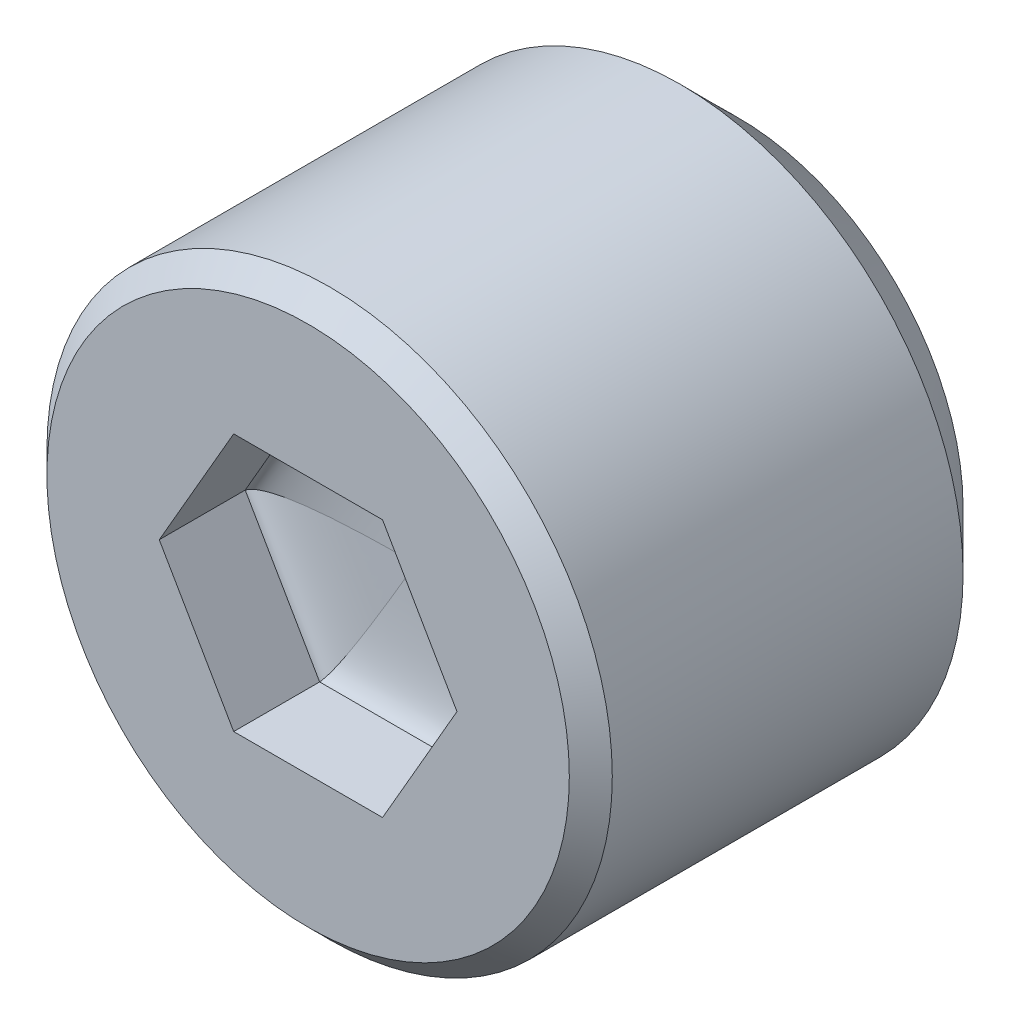
ISO-10303-21;
HEADER;
FILE_DESCRIPTION(('STEP AP214'),'2;1');
FILE_NAME('part.step','',(''),(''),'','','');
FILE_SCHEMA(('AUTOMOTIVE_DESIGN { 1 0 10303 214 1 1 1 1 }'));
ENDSEC;
DATA;
#1=APPLICATION_CONTEXT('core data for automotive mechanical design processes');
#2=APPLICATION_PROTOCOL_DEFINITION('international standard','automotive_design',2000,#1);
#3=PRODUCT_CONTEXT('',#1,'mechanical');
#4=PRODUCT('Part','Part','',(#3));
#5=PRODUCT_RELATED_PRODUCT_CATEGORY('part','',(#4));
#6=PRODUCT_DEFINITION_FORMATION('','',#4);
#7=PRODUCT_DEFINITION_CONTEXT('part definition',#1,'design');
#8=PRODUCT_DEFINITION('design','',#6,#7);
#9=PRODUCT_DEFINITION_SHAPE('','',#8);
#10=(LENGTH_UNIT() NAMED_UNIT(*) SI_UNIT(.MILLI.,.METRE.));
#11=(NAMED_UNIT(*) PLANE_ANGLE_UNIT() SI_UNIT($,.RADIAN.));
#12=(NAMED_UNIT(*) SI_UNIT($,.STERADIAN.) SOLID_ANGLE_UNIT());
#13=UNCERTAINTY_MEASURE_WITH_UNIT(LENGTH_MEASURE(1.E-05),#10,'distance_accuracy_value','');
#14=(GEOMETRIC_REPRESENTATION_CONTEXT(3) GLOBAL_UNCERTAINTY_ASSIGNED_CONTEXT((#13)) GLOBAL_UNIT_ASSIGNED_CONTEXT((#10,
#11,#12)) REPRESENTATION_CONTEXT('',''));
#15=CARTESIAN_POINT('',(0.,0.,0.));
#16=DIRECTION('',(0.,0.,1.));
#17=DIRECTION('',(1.,0.,0.));
#18=AXIS2_PLACEMENT_3D('',#15,#16,#17);
#19=CARTESIAN_POINT('',(0.,0.,5.));
#20=DIRECTION('',(0.,0.,-1.));
#21=DIRECTION('',(-1.,0.,0.));
#22=AXIS2_PLACEMENT_3D('',#19,#20,#21);
#23=CYLINDRICAL_SURFACE('',#22,6.5785);
#24=CARTESIAN_POINT('',(0.,0.,4.5));
#25=DIRECTION('',(0.,0.,1.));
#26=DIRECTION('',(1.,0.,0.));
#27=AXIS2_PLACEMENT_3D('',#24,#25,#26);
#28=CIRCLE('',#27,6.5785);
#29=CARTESIAN_POINT('',(6.5785,0.,4.5));
#30=VERTEX_POINT('',#29);
#31=EDGE_CURVE('E11',#30,#30,#28,.F.);
#32=ORIENTED_EDGE('',*,*,#31,.T.);
#33=EDGE_LOOP('',(#32));
#34=FACE_BOUND('',#33,.T.);
#35=CARTESIAN_POINT('',(0.,0.,-3.66299999999998));
#36=DIRECTION('',(0.,0.,1.));
#37=DIRECTION('',(1.,0.,0.));
#38=AXIS2_PLACEMENT_3D('',#35,#36,#37);
#39=CIRCLE('',#38,6.5785);
#40=CARTESIAN_POINT('',(6.5785,0.,-3.66299999999998));
#41=VERTEX_POINT('',#40);
#42=EDGE_CURVE('E118',#41,#41,#39,.T.);
#43=ORIENTED_EDGE('',*,*,#42,.T.);
#44=EDGE_LOOP('',(#43));
#45=FACE_BOUND('',#44,.T.);
#46=ADVANCED_FACE('F43',(#34,#45),#23,.T.);
#47=CARTESIAN_POINT('',(0.,0.,5.));
#48=DIRECTION('',(0.,0.,1.));
#49=DIRECTION('',(1.,0.,0.));
#50=AXIS2_PLACEMENT_3D('',#47,#48,#49);
#51=PLANE('',#50);
#52=CARTESIAN_POINT('',(0.,0.,5.));
#53=DIRECTION('',(0.,0.,1.));
#54=DIRECTION('',(1.,0.,0.));
#55=AXIS2_PLACEMENT_3D('',#52,#53,#54);
#56=CIRCLE('',#55,6.07849999999999);
#57=CARTESIAN_POINT('',(6.07849999999999,0.,5.));
#58=VERTEX_POINT('',#57);
#59=EDGE_CURVE('E51',#58,#58,#56,.T.);
#60=ORIENTED_EDGE('',*,*,#59,.T.);
#61=EDGE_LOOP('',(#60));
#62=FACE_BOUND('',#61,.T.);
#63=DIRECTION('',(-0.5,0.866025403784439,0.));
#64=VECTOR('',#63,1.);
#65=CARTESIAN_POINT('',(3.46410161513775,0.,5.));
#66=LINE('',#65,#64);
#67=CARTESIAN_POINT('',(3.46410161513775,0.,5.));
#68=VERTEX_POINT('',#67);
#69=CARTESIAN_POINT('',(1.73205080756888,3.,5.));
#70=VERTEX_POINT('',#69);
#71=EDGE_CURVE('E58',#68,#70,#66,.T.);
#72=ORIENTED_EDGE('',*,*,#71,.F.);
#73=DIRECTION('',(0.5,0.866025403784439,0.));
#74=VECTOR('',#73,1.);
#75=CARTESIAN_POINT('',(1.73205080756888,-3.,5.));
#76=LINE('',#75,#74);
#77=CARTESIAN_POINT('',(1.73205080756888,-3.,5.));
#78=VERTEX_POINT('',#77);
#79=EDGE_CURVE('E93',#78,#68,#76,.T.);
#80=ORIENTED_EDGE('',*,*,#79,.F.);
#81=DIRECTION('',(1.,0.,0.));
#82=VECTOR('',#81,1.);
#83=CARTESIAN_POINT('',(-1.73205080756888,-3.,5.));
#84=LINE('',#83,#82);
#85=CARTESIAN_POINT('',(-1.73205080756888,-3.,5.));
#86=VERTEX_POINT('',#85);
#87=EDGE_CURVE('E101',#86,#78,#84,.T.);
#88=ORIENTED_EDGE('',*,*,#87,.F.);
#89=DIRECTION('',(0.5,-0.866025403784439,0.));
#90=VECTOR('',#89,1.);
#91=CARTESIAN_POINT('',(-3.46410161513775,0.,5.));
#92=LINE('',#91,#90);
#93=CARTESIAN_POINT('',(-3.46410161513775,0.,5.));
#94=VERTEX_POINT('',#93);
#95=EDGE_CURVE('E107',#94,#86,#92,.T.);
#96=ORIENTED_EDGE('',*,*,#95,.F.);
#97=DIRECTION('',(-0.5,-0.866025403784439,0.));
#98=VECTOR('',#97,1.);
#99=CARTESIAN_POINT('',(-1.73205080756888,3.,5.));
#100=LINE('',#99,#98);
#101=CARTESIAN_POINT('',(-1.73205080756888,3.,5.));
#102=VERTEX_POINT('',#101);
#103=EDGE_CURVE('E376',#102,#94,#100,.T.);
#104=ORIENTED_EDGE('',*,*,#103,.F.);
#105=DIRECTION('',(-1.,0.,0.));
#106=VECTOR('',#105,1.);
#107=CARTESIAN_POINT('',(1.73205080756888,3.,5.));
#108=LINE('',#107,#106);
#109=EDGE_CURVE('E359',#70,#102,#108,.T.);
#110=ORIENTED_EDGE('',*,*,#109,.F.);
#111=EDGE_LOOP('',(#72,#80,#88,#96,#104,#110));
#112=FACE_BOUND('',#111,.T.);
#113=ADVANCED_FACE('F109',(#62,#112),#51,.T.);
#114=CARTESIAN_POINT('',(0.,0.,-5.));
#115=DIRECTION('',(0.,0.,1.));
#116=DIRECTION('',(1.,0.,0.));
#117=AXIS2_PLACEMENT_3D('',#114,#115,#116);
#118=PLANE('',#117);
#119=CARTESIAN_POINT('',(0.,0.,-5.));
#120=DIRECTION('',(0.,0.,1.));
#121=DIRECTION('',(1.,0.,0.));
#122=AXIS2_PLACEMENT_3D('',#119,#120,#121);
#123=CIRCLE('',#122,5.24149999999999);
#124=CARTESIAN_POINT('',(5.24149999999999,0.,-5.));
#125=VERTEX_POINT('',#124);
#126=EDGE_CURVE('E129',#125,#125,#123,.F.);
#127=ORIENTED_EDGE('',*,*,#126,.T.);
#128=EDGE_LOOP('',(#127));
#129=FACE_BOUND('',#128,.T.);
#130=ADVANCED_FACE('F151',(#129),#118,.F.);
#131=CARTESIAN_POINT('',(0.,0.,-3.66299999999998));
#132=DIRECTION('',(0.,0.,1.));
#133=DIRECTION('',(1.,0.,0.));
#134=AXIS2_PLACEMENT_3D('',#131,#132,#133);
#135=CONICAL_SURFACE('',#134,6.5785,0.785398163397443);
#136=ORIENTED_EDGE('',*,*,#126,.F.);
#137=EDGE_LOOP('',(#136));
#138=FACE_BOUND('',#137,.T.);
#139=ORIENTED_EDGE('',*,*,#42,.F.);
#140=EDGE_LOOP('',(#139));
#141=FACE_BOUND('',#140,.T.);
#142=ADVANCED_FACE('F155',(#138,#141),#135,.T.);
#143=CARTESIAN_POINT('',(3.46410161513775,0.,3.));
#144=DIRECTION('',(0.866025403784439,0.5,0.));
#145=DIRECTION('',(-0.5,0.866025403784439,0.));
#146=AXIS2_PLACEMENT_3D('',#143,#144,#145);
#147=PLANE('',#146);
#148=ORIENTED_EDGE('',*,*,#71,.T.);
#149=DIRECTION('',(0.,0.,1.));
#150=VECTOR('',#149,1.);
#151=CARTESIAN_POINT('',(1.73205080756888,3.,3.));
#152=LINE('',#151,#150);
#153=CARTESIAN_POINT('',(1.73205080756888,3.,3.));
#154=VERTEX_POINT('',#153);
#155=EDGE_CURVE('E125',#154,#70,#152,.T.);
#156=ORIENTED_EDGE('',*,*,#155,.F.);
#157=DIRECTION('',(-0.5,0.866025403784439,0.));
#158=VECTOR('',#157,1.);
#159=CARTESIAN_POINT('',(3.46410161513775,0.,3.));
#160=LINE('',#159,#158);
#161=CARTESIAN_POINT('',(3.46410161513775,0.,3.));
#162=VERTEX_POINT('',#161);
#163=EDGE_CURVE('E111',#162,#154,#160,.T.);
#164=ORIENTED_EDGE('',*,*,#163,.F.);
#165=DIRECTION('',(0.,0.,1.));
#166=VECTOR('',#165,1.);
#167=CARTESIAN_POINT('',(3.46410161513775,0.,3.));
#168=LINE('',#167,#166);
#169=EDGE_CURVE('E97',#162,#68,#168,.T.);
#170=ORIENTED_EDGE('',*,*,#169,.T.);
#171=EDGE_LOOP('',(#148,#156,#164,#170));
#172=FACE_BOUND('',#171,.T.);
#173=ADVANCED_FACE('F157',(#172),#147,.F.);
#174=CARTESIAN_POINT('',(1.73205080756888,-3.,3.));
#175=DIRECTION('',(0.866025403784439,-0.5,0.));
#176=DIRECTION('',(0.5,0.866025403784439,0.));
#177=AXIS2_PLACEMENT_3D('',#174,#175,#176);
#178=PLANE('',#177);
#179=ORIENTED_EDGE('',*,*,#79,.T.);
#180=ORIENTED_EDGE('',*,*,#169,.F.);
#181=DIRECTION('',(0.5,0.866025403784439,0.));
#182=VECTOR('',#181,1.);
#183=CARTESIAN_POINT('',(1.73205080756888,-3.,3.));
#184=LINE('',#183,#182);
#185=CARTESIAN_POINT('',(1.73205080756888,-3.,3.));
#186=VERTEX_POINT('',#185);
#187=EDGE_CURVE('E95',#186,#162,#184,.T.);
#188=ORIENTED_EDGE('',*,*,#187,.F.);
#189=DIRECTION('',(0.,0.,1.));
#190=VECTOR('',#189,1.);
#191=CARTESIAN_POINT('',(1.73205080756888,-3.,3.));
#192=LINE('',#191,#190);
#193=EDGE_CURVE('E88',#186,#78,#192,.T.);
#194=ORIENTED_EDGE('',*,*,#193,.T.);
#195=EDGE_LOOP('',(#179,#180,#188,#194));
#196=FACE_BOUND('',#195,.T.);
#197=ADVANCED_FACE('F90',(#196),#178,.F.);
#198=CARTESIAN_POINT('',(-1.73205080756888,-3.,3.));
#199=DIRECTION('',(0.,-1.,0.));
#200=DIRECTION('',(0.,0.,-1.));
#201=AXIS2_PLACEMENT_3D('',#198,#199,#200);
#202=PLANE('',#201);
#203=ORIENTED_EDGE('',*,*,#87,.T.);
#204=ORIENTED_EDGE('',*,*,#193,.F.);
#205=DIRECTION('',(1.,0.,0.));
#206=VECTOR('',#205,1.);
#207=CARTESIAN_POINT('',(-1.73205080756888,-3.,3.));
#208=LINE('',#207,#206);
#209=CARTESIAN_POINT('',(-1.73205080756888,-3.,3.));
#210=VERTEX_POINT('',#209);
#211=EDGE_CURVE('E67',#210,#186,#208,.T.);
#212=ORIENTED_EDGE('',*,*,#211,.F.);
#213=DIRECTION('',(0.,0.,1.));
#214=VECTOR('',#213,1.);
#215=CARTESIAN_POINT('',(-1.73205080756888,-3.,3.));
#216=LINE('',#215,#214);
#217=EDGE_CURVE('E98',#210,#86,#216,.T.);
#218=ORIENTED_EDGE('',*,*,#217,.T.);
#219=EDGE_LOOP('',(#203,#204,#212,#218));
#220=FACE_BOUND('',#219,.T.);
#221=ADVANCED_FACE('F102',(#220),#202,.F.);
#222=CARTESIAN_POINT('',(-3.46410161513775,0.,3.));
#223=DIRECTION('',(-0.866025403784439,-0.5,0.));
#224=DIRECTION('',(0.5,-0.866025403784439,0.));
#225=AXIS2_PLACEMENT_3D('',#222,#223,#224);
#226=PLANE('',#225);
#227=ORIENTED_EDGE('',*,*,#95,.T.);
#228=ORIENTED_EDGE('',*,*,#217,.F.);
#229=DIRECTION('',(0.5,-0.866025403784439,0.));
#230=VECTOR('',#229,1.);
#231=CARTESIAN_POINT('',(-3.46410161513775,0.,3.));
#232=LINE('',#231,#230);
#233=CARTESIAN_POINT('',(-3.46410161513775,0.,3.));
#234=VERTEX_POINT('',#233);
#235=EDGE_CURVE('E366',#234,#210,#232,.T.);
#236=ORIENTED_EDGE('',*,*,#235,.F.);
#237=DIRECTION('',(0.,0.,1.));
#238=VECTOR('',#237,1.);
#239=CARTESIAN_POINT('',(-3.46410161513775,0.,3.));
#240=LINE('',#239,#238);
#241=EDGE_CURVE('E121',#234,#94,#240,.T.);
#242=ORIENTED_EDGE('',*,*,#241,.T.);
#243=EDGE_LOOP('',(#227,#228,#236,#242));
#244=FACE_BOUND('',#243,.T.);
#245=ADVANCED_FACE('F203',(#244),#226,.F.);
#246=CARTESIAN_POINT('',(-1.73205080756888,3.,3.));
#247=DIRECTION('',(-0.866025403784439,0.5,0.));
#248=DIRECTION('',(-0.5,-0.866025403784439,0.));
#249=AXIS2_PLACEMENT_3D('',#246,#247,#248);
#250=PLANE('',#249);
#251=ORIENTED_EDGE('',*,*,#103,.T.);
#252=ORIENTED_EDGE('',*,*,#241,.F.);
#253=DIRECTION('',(-0.5,-0.866025403784439,0.));
#254=VECTOR('',#253,1.);
#255=CARTESIAN_POINT('',(-1.73205080756888,3.,3.));
#256=LINE('',#255,#254);
#257=CARTESIAN_POINT('',(-1.73205080756888,3.,3.));
#258=VERTEX_POINT('',#257);
#259=EDGE_CURVE('E355',#258,#234,#256,.T.);
#260=ORIENTED_EDGE('',*,*,#259,.F.);
#261=DIRECTION('',(0.,0.,1.));
#262=VECTOR('',#261,1.);
#263=CARTESIAN_POINT('',(-1.73205080756888,3.,3.));
#264=LINE('',#263,#262);
#265=EDGE_CURVE('E123',#258,#102,#264,.T.);
#266=ORIENTED_EDGE('',*,*,#265,.T.);
#267=EDGE_LOOP('',(#251,#252,#260,#266));
#268=FACE_BOUND('',#267,.T.);
#269=ADVANCED_FACE('F212',(#268),#250,.F.);
#270=CARTESIAN_POINT('',(1.73205080756888,3.,3.));
#271=DIRECTION('',(0.,1.,0.));
#272=DIRECTION('',(0.,0.,1.));
#273=AXIS2_PLACEMENT_3D('',#270,#271,#272);
#274=PLANE('',#273);
#275=ORIENTED_EDGE('',*,*,#109,.T.);
#276=ORIENTED_EDGE('',*,*,#265,.F.);
#277=DIRECTION('',(-1.,0.,0.));
#278=VECTOR('',#277,1.);
#279=CARTESIAN_POINT('',(1.73205080756888,3.,3.));
#280=LINE('',#279,#278);
#281=EDGE_CURVE('E114',#154,#258,#280,.T.);
#282=ORIENTED_EDGE('',*,*,#281,.F.);
#283=ORIENTED_EDGE('',*,*,#155,.T.);
#284=EDGE_LOOP('',(#275,#276,#282,#283));
#285=FACE_BOUND('',#284,.T.);
#286=ADVANCED_FACE('F222',(#285),#274,.F.);
#287=CARTESIAN_POINT('',(-1.73205080756888,-3.,3.));
#288=CARTESIAN_POINT('',(-1.64544826719043,-2.85,2.5));
#289=CARTESIAN_POINT('',(0.,0.,2.5));
#290=CARTESIAN_POINT('',(1.73205080756888,-3.,3.));
#291=CARTESIAN_POINT('',(1.64544826719043,-2.85,2.5));
#292=CARTESIAN_POINT('',(0.,0.,2.5));
#293=(BOUNDED_SURFACE() B_SPLINE_SURFACE(1,2,((#287,#288,#289),(#290,#291,#292)),.UNSPECIFIED.,
.F.,.F.,.F.) B_SPLINE_SURFACE_WITH_KNOTS((2,2),(3,3),(0.,1.),(0.,1.),
.UNSPECIFIED.) GEOMETRIC_REPRESENTATION_ITEM() RATIONAL_B_SPLINE_SURFACE(((1.,1.,1.),(1.,1.,1.))) REPRESENTATION_ITEM('') SURFACE());
#294=CARTESIAN_POINT('',(1.73205080756888,-3.,3.));
#295=CARTESIAN_POINT('',(1.64544826719043,-2.85,2.5));
#296=CARTESIAN_POINT('',(0.,0.,2.5));
#297=(BOUNDED_CURVE() B_SPLINE_CURVE(2,(#294,#295,#296),.UNSPECIFIED.,.F.,
.F.) B_SPLINE_CURVE_WITH_KNOTS((3,3),(0.,1.),
.UNSPECIFIED.) CURVE() GEOMETRIC_REPRESENTATION_ITEM() RATIONAL_B_SPLINE_CURVE((1.,1.,1.)) REPRESENTATION_ITEM(''));
#298=CARTESIAN_POINT('',(0.,0.,2.5));
#299=VERTEX_POINT('',#298);
#300=EDGE_CURVE('E374',#186,#299,#297,.T.);
#301=CARTESIAN_POINT('',(-1.73205080756888,-3.,3.));
#302=CARTESIAN_POINT('',(-1.64544826719043,-2.85,2.5));
#303=CARTESIAN_POINT('',(0.,0.,2.5));
#304=(BOUNDED_CURVE() B_SPLINE_CURVE(2,(#301,#302,#303),.UNSPECIFIED.,.F.,
.F.) B_SPLINE_CURVE_WITH_KNOTS((3,3),(0.,1.),
.UNSPECIFIED.) CURVE() GEOMETRIC_REPRESENTATION_ITEM() RATIONAL_B_SPLINE_CURVE((1.,1.,1.)) REPRESENTATION_ITEM(''));
#305=EDGE_CURVE('E381',#210,#299,#304,.T.);
#306=ORIENTED_EDGE('',*,*,#211,.T.);
#307=ORIENTED_EDGE('',*,*,#300,.T.);
#308=ORIENTED_EDGE('',*,*,#305,.F.);
#309=EDGE_LOOP('',(#306,#307,#308));
#310=FACE_BOUND('',#309,.T.);
#311=ADVANCED_FACE('F232',(#310),#293,.T.);
#312=CARTESIAN_POINT('',(-3.46410161513775,0.,3.));
#313=CARTESIAN_POINT('',(-3.29089653438087,0.,2.5));
#314=CARTESIAN_POINT('',(0.,0.,2.5));
#315=CARTESIAN_POINT('',(-1.73205080756888,-3.,3.));
#316=CARTESIAN_POINT('',(-1.64544826719043,-2.85,2.5));
#317=CARTESIAN_POINT('',(0.,0.,2.5));
#318=(BOUNDED_SURFACE() B_SPLINE_SURFACE(1,2,((#312,#313,#314),(#315,#316,#317)),.UNSPECIFIED.,
.F.,.F.,.F.) B_SPLINE_SURFACE_WITH_KNOTS((2,2),(3,3),(0.,1.),(0.,1.),
.UNSPECIFIED.) GEOMETRIC_REPRESENTATION_ITEM() RATIONAL_B_SPLINE_SURFACE(((1.,1.,1.),(1.,1.,1.))) REPRESENTATION_ITEM('') SURFACE());
#319=CARTESIAN_POINT('',(-3.46410161513776,0.,3.));
#320=CARTESIAN_POINT('',(-3.29089653438087,0.,2.5));
#321=CARTESIAN_POINT('',(0.,0.,2.5));
#322=(BOUNDED_CURVE() B_SPLINE_CURVE(2,(#319,#320,#321),.UNSPECIFIED.,.F.,
.F.) B_SPLINE_CURVE_WITH_KNOTS((3,3),(0.,1.),
.UNSPECIFIED.) CURVE() GEOMETRIC_REPRESENTATION_ITEM() RATIONAL_B_SPLINE_CURVE((1.,1.,1.)) REPRESENTATION_ITEM(''));
#323=EDGE_CURVE('E382',#234,#299,#322,.T.);
#324=ORIENTED_EDGE('',*,*,#235,.T.);
#325=ORIENTED_EDGE('',*,*,#305,.T.);
#326=ORIENTED_EDGE('',*,*,#323,.F.);
#327=EDGE_LOOP('',(#324,#325,#326));
#328=FACE_BOUND('',#327,.T.);
#329=ADVANCED_FACE('F242',(#328),#318,.T.);
#330=CARTESIAN_POINT('',(-1.73205080756888,3.,3.));
#331=CARTESIAN_POINT('',(-1.64544826719043,2.85,2.5));
#332=CARTESIAN_POINT('',(0.,0.,2.5));
#333=CARTESIAN_POINT('',(-3.46410161513776,0.,3.));
#334=CARTESIAN_POINT('',(-3.29089653438087,0.,2.5));
#335=CARTESIAN_POINT('',(0.,0.,2.5));
#336=(BOUNDED_SURFACE() B_SPLINE_SURFACE(1,2,((#330,#331,#332),(#333,#334,#335)),.UNSPECIFIED.,
.F.,.F.,.F.) B_SPLINE_SURFACE_WITH_KNOTS((2,2),(3,3),(0.,1.),(0.,1.),
.UNSPECIFIED.) GEOMETRIC_REPRESENTATION_ITEM() RATIONAL_B_SPLINE_SURFACE(((1.,1.,1.),(1.,1.,1.))) REPRESENTATION_ITEM('') SURFACE());
#337=CARTESIAN_POINT('',(-1.73205080756888,3.,3.));
#338=CARTESIAN_POINT('',(-1.64544826719043,2.85,2.5));
#339=CARTESIAN_POINT('',(0.,0.,2.5));
#340=(BOUNDED_CURVE() B_SPLINE_CURVE(2,(#337,#338,#339),.UNSPECIFIED.,.F.,
.F.) B_SPLINE_CURVE_WITH_KNOTS((3,3),(0.,1.),
.UNSPECIFIED.) CURVE() GEOMETRIC_REPRESENTATION_ITEM() RATIONAL_B_SPLINE_CURVE((1.,1.,1.)) REPRESENTATION_ITEM(''));
#341=EDGE_CURVE('E349',#258,#299,#340,.T.);
#342=ORIENTED_EDGE('',*,*,#259,.T.);
#343=ORIENTED_EDGE('',*,*,#323,.T.);
#344=ORIENTED_EDGE('',*,*,#341,.F.);
#345=EDGE_LOOP('',(#342,#343,#344));
#346=FACE_BOUND('',#345,.T.);
#347=ADVANCED_FACE('F251',(#346),#336,.T.);
#348=CARTESIAN_POINT('',(1.73205080756888,-3.,3.));
#349=CARTESIAN_POINT('',(1.64544826719043,-2.85,2.5));
#350=CARTESIAN_POINT('',(0.,0.,2.5));
#351=CARTESIAN_POINT('',(3.46410161513775,0.,3.));
#352=CARTESIAN_POINT('',(3.29089653438087,0.,2.5));
#353=CARTESIAN_POINT('',(0.,0.,2.5));
#354=(BOUNDED_SURFACE() B_SPLINE_SURFACE(1,2,((#348,#349,#350),(#351,#352,#353)),.UNSPECIFIED.,
.F.,.F.,.F.) B_SPLINE_SURFACE_WITH_KNOTS((2,2),(3,3),(0.,1.),(0.,1.),
.UNSPECIFIED.) GEOMETRIC_REPRESENTATION_ITEM() RATIONAL_B_SPLINE_SURFACE(((1.,1.,1.),(1.,1.,1.))) REPRESENTATION_ITEM('') SURFACE());
#355=CARTESIAN_POINT('',(3.46410161513775,0.,3.));
#356=CARTESIAN_POINT('',(3.29089653438087,0.,2.5));
#357=CARTESIAN_POINT('',(0.,0.,2.5));
#358=(BOUNDED_CURVE() B_SPLINE_CURVE(2,(#355,#356,#357),.UNSPECIFIED.,.F.,
.F.) B_SPLINE_CURVE_WITH_KNOTS((3,3),(0.,1.),
.UNSPECIFIED.) CURVE() GEOMETRIC_REPRESENTATION_ITEM() RATIONAL_B_SPLINE_CURVE((1.,1.,1.)) REPRESENTATION_ITEM(''));
#359=EDGE_CURVE('E388',#299,#162,#358,.F.);
#360=ORIENTED_EDGE('',*,*,#187,.T.);
#361=ORIENTED_EDGE('',*,*,#359,.F.);
#362=ORIENTED_EDGE('',*,*,#300,.F.);
#363=EDGE_LOOP('',(#360,#361,#362));
#364=FACE_BOUND('',#363,.T.);
#365=ADVANCED_FACE('F261',(#364),#354,.T.);
#366=CARTESIAN_POINT('',(1.73205080756888,3.,3.));
#367=CARTESIAN_POINT('',(1.64544826719043,2.85,2.5));
#368=CARTESIAN_POINT('',(0.,0.,2.5));
#369=CARTESIAN_POINT('',(-1.73205080756888,3.,3.));
#370=CARTESIAN_POINT('',(-1.64544826719043,2.85,2.5));
#371=CARTESIAN_POINT('',(0.,0.,2.5));
#372=(BOUNDED_SURFACE() B_SPLINE_SURFACE(1,2,((#366,#367,#368),(#369,#370,#371)),.UNSPECIFIED.,
.F.,.F.,.F.) B_SPLINE_SURFACE_WITH_KNOTS((2,2),(3,3),(0.,1.),(0.,1.),
.UNSPECIFIED.) GEOMETRIC_REPRESENTATION_ITEM() RATIONAL_B_SPLINE_SURFACE(((1.,1.,1.),(1.,1.,1.))) REPRESENTATION_ITEM('') SURFACE());
#373=CARTESIAN_POINT('',(1.73205080756888,3.,3.));
#374=CARTESIAN_POINT('',(1.64544826719043,2.85,2.5));
#375=CARTESIAN_POINT('',(0.,0.,2.5));
#376=(BOUNDED_CURVE() B_SPLINE_CURVE(2,(#373,#374,#375),.UNSPECIFIED.,.F.,
.F.) B_SPLINE_CURVE_WITH_KNOTS((3,3),(0.,1.),
.UNSPECIFIED.) CURVE() GEOMETRIC_REPRESENTATION_ITEM() RATIONAL_B_SPLINE_CURVE((1.,1.,1.)) REPRESENTATION_ITEM(''));
#377=EDGE_CURVE('E352',#154,#299,#376,.T.);
#378=ORIENTED_EDGE('',*,*,#281,.T.);
#379=ORIENTED_EDGE('',*,*,#341,.T.);
#380=ORIENTED_EDGE('',*,*,#377,.F.);
#381=EDGE_LOOP('',(#378,#379,#380));
#382=FACE_BOUND('',#381,.T.);
#383=ADVANCED_FACE('F142',(#382),#372,.T.);
#384=CARTESIAN_POINT('',(3.46410161513775,0.,3.));
#385=CARTESIAN_POINT('',(3.29089653438087,0.,2.5));
#386=CARTESIAN_POINT('',(0.,0.,2.5));
#387=CARTESIAN_POINT('',(1.73205080756888,3.,3.));
#388=CARTESIAN_POINT('',(1.64544826719043,2.85,2.5));
#389=CARTESIAN_POINT('',(0.,0.,2.5));
#390=(BOUNDED_SURFACE() B_SPLINE_SURFACE(1,2,((#384,#385,#386),(#387,#388,#389)),.UNSPECIFIED.,
.F.,.F.,.F.) B_SPLINE_SURFACE_WITH_KNOTS((2,2),(3,3),(0.,1.),(0.,1.),
.UNSPECIFIED.) GEOMETRIC_REPRESENTATION_ITEM() RATIONAL_B_SPLINE_SURFACE(((1.,1.,1.),(1.,1.,1.))) REPRESENTATION_ITEM('') SURFACE());
#391=ORIENTED_EDGE('',*,*,#163,.T.);
#392=ORIENTED_EDGE('',*,*,#377,.T.);
#393=ORIENTED_EDGE('',*,*,#359,.T.);
#394=EDGE_LOOP('',(#391,#392,#393));
#395=FACE_BOUND('',#394,.T.);
#396=ADVANCED_FACE('F136',(#395),#390,.T.);
#397=CARTESIAN_POINT('',(0.,0.,5.));
#398=DIRECTION('',(0.,0.,-1.));
#399=DIRECTION('',(-1.,0.,0.));
#400=AXIS2_PLACEMENT_3D('',#397,#398,#399);
#401=CONICAL_SURFACE('',#400,6.07849999999999,0.785398163397453);
#402=ORIENTED_EDGE('',*,*,#31,.F.);
#403=EDGE_LOOP('',(#402));
#404=FACE_BOUND('',#403,.T.);
#405=ORIENTED_EDGE('',*,*,#59,.F.);
#406=EDGE_LOOP('',(#405));
#407=FACE_BOUND('',#406,.T.);
#408=ADVANCED_FACE('F45',(#404,#407),#401,.T.);
#409=CLOSED_SHELL('',(#46,#113,#130,#142,#173,#197,#221,#245,#269,#286,#311,#329,#347,#365,#383,
#396,#408));
#410=MANIFOLD_SOLID_BREP('B2',#409);
#411=ADVANCED_BREP_SHAPE_REPRESENTATION('',(#18,#410),#14);
#412=SHAPE_DEFINITION_REPRESENTATION(#9,#411);
ENDSEC;
END-ISO-10303-21;
